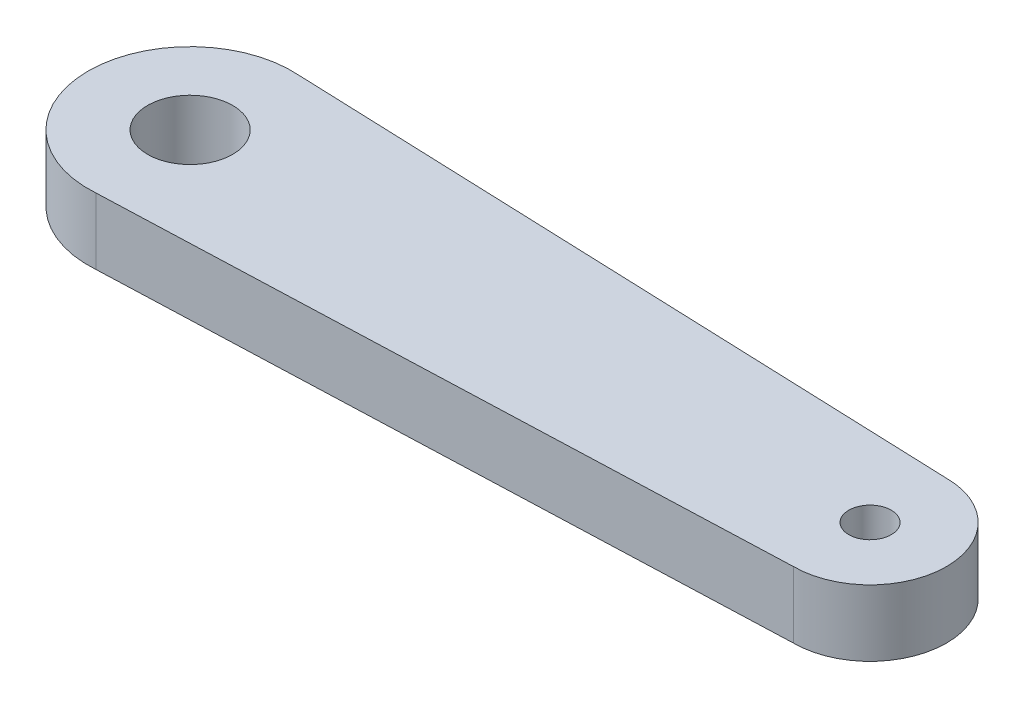
ISO-10303-21;
HEADER;
FILE_DESCRIPTION(('STEP AP214'),'2;1');
FILE_NAME('part.step','',(''),(''),'','','');
FILE_SCHEMA(('AUTOMOTIVE_DESIGN { 1 0 10303 214 1 1 1 1 }'));
ENDSEC;
DATA;
#1=APPLICATION_CONTEXT('core data for automotive mechanical design processes');
#2=APPLICATION_PROTOCOL_DEFINITION('international standard','automotive_design',2000,#1);
#3=PRODUCT_CONTEXT('',#1,'mechanical');
#4=PRODUCT('Part','Part','',(#3));
#5=PRODUCT_RELATED_PRODUCT_CATEGORY('part','',(#4));
#6=PRODUCT_DEFINITION_FORMATION('','',#4);
#7=PRODUCT_DEFINITION_CONTEXT('part definition',#1,'design');
#8=PRODUCT_DEFINITION('design','',#6,#7);
#9=PRODUCT_DEFINITION_SHAPE('','',#8);
#10=(LENGTH_UNIT() NAMED_UNIT(*) SI_UNIT(.MILLI.,.METRE.));
#11=(NAMED_UNIT(*) PLANE_ANGLE_UNIT() SI_UNIT($,.RADIAN.));
#12=(NAMED_UNIT(*) SI_UNIT($,.STERADIAN.) SOLID_ANGLE_UNIT());
#13=UNCERTAINTY_MEASURE_WITH_UNIT(LENGTH_MEASURE(1.E-05),#10,'distance_accuracy_value','');
#14=(GEOMETRIC_REPRESENTATION_CONTEXT(3) GLOBAL_UNCERTAINTY_ASSIGNED_CONTEXT((#13)) GLOBAL_UNIT_ASSIGNED_CONTEXT((#10,
#11,#12)) REPRESENTATION_CONTEXT('',''));
#15=CARTESIAN_POINT('',(0.,0.,0.));
#16=DIRECTION('',(0.,0.,1.));
#17=DIRECTION('',(1.,0.,0.));
#18=AXIS2_PLACEMENT_3D('',#15,#16,#17);
#19=CARTESIAN_POINT('',(0.,3.9,0.));
#20=DIRECTION('',(0.,-1.,0.));
#21=DIRECTION('',(0.,0.,-1.));
#22=AXIS2_PLACEMENT_3D('',#19,#20,#21);
#23=CYLINDRICAL_SURFACE('',#22,6.);
#24=CARTESIAN_POINT('',(0.,0.,0.));
#25=DIRECTION('',(0.,1.,0.));
#26=DIRECTION('',(0.,0.,1.));
#27=AXIS2_PLACEMENT_3D('',#24,#25,#26);
#28=CIRCLE('',#27,6.);
#29=CARTESIAN_POINT('',(0.449368076142934,0.,-5.98314869714464));
#30=VERTEX_POINT('',#29);
#31=CARTESIAN_POINT('',(0.449368076142934,0.,5.98314869714464));
#32=VERTEX_POINT('',#31);
#33=EDGE_CURVE('E110',#30,#32,#28,.T.);
#34=ORIENTED_EDGE('',*,*,#33,.T.);
#35=DIRECTION('',(0.,-1.,0.));
#36=VECTOR('',#35,1.);
#37=CARTESIAN_POINT('',(0.449368076142934,3.9,5.98314869714464));
#38=LINE('',#37,#36);
#39=CARTESIAN_POINT('',(0.449368076142934,3.9,5.98314869714464));
#40=VERTEX_POINT('',#39);
#41=EDGE_CURVE('E11',#40,#32,#38,.T.);
#42=ORIENTED_EDGE('',*,*,#41,.F.);
#43=CARTESIAN_POINT('',(0.,3.9,0.));
#44=DIRECTION('',(0.,1.,0.));
#45=DIRECTION('',(0.,0.,1.));
#46=AXIS2_PLACEMENT_3D('',#43,#44,#45);
#47=CIRCLE('',#46,6.);
#48=CARTESIAN_POINT('',(0.449368076142934,3.9,-5.98314869714464));
#49=VERTEX_POINT('',#48);
#50=EDGE_CURVE('E91',#49,#40,#47,.T.);
#51=ORIENTED_EDGE('',*,*,#50,.F.);
#52=DIRECTION('',(0.,-1.,0.));
#53=VECTOR('',#52,1.);
#54=CARTESIAN_POINT('',(0.449368076142934,3.9,-5.98314869714464));
#55=LINE('',#54,#53);
#56=EDGE_CURVE('E58',#49,#30,#55,.T.);
#57=ORIENTED_EDGE('',*,*,#56,.T.);
#58=EDGE_LOOP('',(#34,#42,#51,#57));
#59=FACE_BOUND('',#58,.T.);
#60=ADVANCED_FACE('F39',(#59),#23,.T.);
#61=CARTESIAN_POINT('',(0.449368076142934,3.9,5.98314869714464));
#62=DIRECTION('',(-0.0374736605890943,0.,-0.999297615709181));
#63=DIRECTION('',(-0.999297615709181,0.,0.0374736605890943));
#64=AXIS2_PLACEMENT_3D('',#61,#62,#63);
#65=PLANE('',#64);
#66=DIRECTION('',(0.999297615709181,0.,-0.0374736605890943));
#67=VECTOR('',#66,1.);
#68=CARTESIAN_POINT('',(0.449368076142934,0.,5.98314869714464));
#69=LINE('',#68,#67);
#70=CARTESIAN_POINT('',(40.,0.,4.5));
#71=VERTEX_POINT('',#70);
#72=EDGE_CURVE('E97',#32,#71,#69,.T.);
#73=ORIENTED_EDGE('',*,*,#72,.T.);
#74=DIRECTION('',(0.,-1.,0.));
#75=VECTOR('',#74,1.);
#76=CARTESIAN_POINT('',(40.,3.9,4.5));
#77=LINE('',#76,#75);
#78=CARTESIAN_POINT('',(40.,3.9,4.5));
#79=VERTEX_POINT('',#78);
#80=EDGE_CURVE('E49',#79,#71,#77,.T.);
#81=ORIENTED_EDGE('',*,*,#80,.F.);
#82=DIRECTION('',(0.999297615709181,0.,-0.0374736605890943));
#83=VECTOR('',#82,1.);
#84=CARTESIAN_POINT('',(0.449368076142934,3.9,5.98314869714464));
#85=LINE('',#84,#83);
#86=EDGE_CURVE('E84',#40,#79,#85,.T.);
#87=ORIENTED_EDGE('',*,*,#86,.F.);
#88=ORIENTED_EDGE('',*,*,#41,.T.);
#89=EDGE_LOOP('',(#73,#81,#87,#88));
#90=FACE_BOUND('',#89,.T.);
#91=ADVANCED_FACE('F96',(#90),#65,.F.);
#92=CARTESIAN_POINT('',(40.,3.9,0.));
#93=DIRECTION('',(0.,-1.,0.));
#94=DIRECTION('',(0.,0.,-1.));
#95=AXIS2_PLACEMENT_3D('',#92,#93,#94);
#96=CYLINDRICAL_SURFACE('',#95,4.5);
#97=CARTESIAN_POINT('',(40.,0.,0.));
#98=DIRECTION('',(0.,1.,0.));
#99=DIRECTION('',(0.,0.,1.));
#100=AXIS2_PLACEMENT_3D('',#97,#98,#99);
#101=CIRCLE('',#100,4.5);
#102=CARTESIAN_POINT('',(40.,0.,-4.5));
#103=VERTEX_POINT('',#102);
#104=EDGE_CURVE('E116',#71,#103,#101,.T.);
#105=ORIENTED_EDGE('',*,*,#104,.T.);
#106=DIRECTION('',(0.,-1.,0.));
#107=VECTOR('',#106,1.);
#108=CARTESIAN_POINT('',(40.,3.9,-4.5));
#109=LINE('',#108,#107);
#110=CARTESIAN_POINT('',(40.,3.9,-4.5));
#111=VERTEX_POINT('',#110);
#112=EDGE_CURVE('E73',#111,#103,#109,.T.);
#113=ORIENTED_EDGE('',*,*,#112,.F.);
#114=CARTESIAN_POINT('',(40.,3.9,0.));
#115=DIRECTION('',(0.,1.,0.));
#116=DIRECTION('',(0.,0.,1.));
#117=AXIS2_PLACEMENT_3D('',#114,#115,#116);
#118=CIRCLE('',#117,4.5);
#119=EDGE_CURVE('E90',#79,#111,#118,.T.);
#120=ORIENTED_EDGE('',*,*,#119,.F.);
#121=ORIENTED_EDGE('',*,*,#80,.T.);
#122=EDGE_LOOP('',(#105,#113,#120,#121));
#123=FACE_BOUND('',#122,.T.);
#124=ADVANCED_FACE('F102',(#123),#96,.T.);
#125=CARTESIAN_POINT('',(0.449368076142934,3.9,-5.98314869714464));
#126=DIRECTION('',(0.0374736605890943,0.,-0.999297615709181));
#127=DIRECTION('',(-0.999297615709181,0.,-0.0374736605890943));
#128=AXIS2_PLACEMENT_3D('',#125,#126,#127);
#129=PLANE('',#128);
#130=DIRECTION('',(0.999297615709181,0.,0.0374736605890943));
#131=VECTOR('',#130,1.);
#132=CARTESIAN_POINT('',(0.449368076142934,0.,-5.98314869714464));
#133=LINE('',#132,#131);
#134=EDGE_CURVE('E119',#30,#103,#133,.T.);
#135=ORIENTED_EDGE('',*,*,#134,.F.);
#136=ORIENTED_EDGE('',*,*,#56,.F.);
#137=DIRECTION('',(0.999297615709181,0.,0.0374736605890943));
#138=VECTOR('',#137,1.);
#139=CARTESIAN_POINT('',(0.449368076142934,3.9,-5.98314869714464));
#140=LINE('',#139,#138);
#141=EDGE_CURVE('E104',#49,#111,#140,.T.);
#142=ORIENTED_EDGE('',*,*,#141,.T.);
#143=ORIENTED_EDGE('',*,*,#112,.T.);
#144=EDGE_LOOP('',(#135,#136,#142,#143));
#145=FACE_BOUND('',#144,.T.);
#146=ADVANCED_FACE('F158',(#145),#129,.T.);
#147=CARTESIAN_POINT('',(0.,3.9,0.));
#148=DIRECTION('',(0.,1.,0.));
#149=DIRECTION('',(0.,0.,1.));
#150=AXIS2_PLACEMENT_3D('',#147,#148,#149);
#151=PLANE('',#150);
#152=CARTESIAN_POINT('',(0.,3.9,0.));
#153=DIRECTION('',(0.,1.,0.));
#154=DIRECTION('',(0.,0.,1.));
#155=AXIS2_PLACEMENT_3D('',#152,#153,#154);
#156=CIRCLE('',#155,2.5);
#157=CARTESIAN_POINT('',(0.,3.9,2.5));
#158=VERTEX_POINT('',#157);
#159=EDGE_CURVE('E113',#158,#158,#156,.F.);
#160=ORIENTED_EDGE('',*,*,#159,.T.);
#161=EDGE_LOOP('',(#160));
#162=FACE_BOUND('',#161,.T.);
#163=CARTESIAN_POINT('',(40.,3.9,0.));
#164=DIRECTION('',(0.,1.,0.));
#165=DIRECTION('',(0.,0.,1.));
#166=AXIS2_PLACEMENT_3D('',#163,#164,#165);
#167=CIRCLE('',#166,1.25);
#168=CARTESIAN_POINT('',(40.,3.9,1.25));
#169=VERTEX_POINT('',#168);
#170=EDGE_CURVE('E129',#169,#169,#167,.F.);
#171=ORIENTED_EDGE('',*,*,#170,.T.);
#172=EDGE_LOOP('',(#171));
#173=FACE_BOUND('',#172,.T.);
#174=ORIENTED_EDGE('',*,*,#50,.T.);
#175=ORIENTED_EDGE('',*,*,#86,.T.);
#176=ORIENTED_EDGE('',*,*,#119,.T.);
#177=ORIENTED_EDGE('',*,*,#141,.F.);
#178=EDGE_LOOP('',(#174,#175,#176,#177));
#179=FACE_BOUND('',#178,.T.);
#180=ADVANCED_FACE('F87',(#162,#173,#179),#151,.T.);
#181=CARTESIAN_POINT('',(0.,0.,0.));
#182=DIRECTION('',(0.,1.,0.));
#183=DIRECTION('',(0.,0.,1.));
#184=AXIS2_PLACEMENT_3D('',#181,#182,#183);
#185=PLANE('',#184);
#186=CARTESIAN_POINT('',(0.,0.,0.));
#187=DIRECTION('',(0.,1.,0.));
#188=DIRECTION('',(0.,0.,1.));
#189=AXIS2_PLACEMENT_3D('',#186,#187,#188);
#190=CIRCLE('',#189,2.5);
#191=CARTESIAN_POINT('',(0.,0.,2.5));
#192=VERTEX_POINT('',#191);
#193=EDGE_CURVE('E42',#192,#192,#190,.F.);
#194=ORIENTED_EDGE('',*,*,#193,.F.);
#195=EDGE_LOOP('',(#194));
#196=FACE_BOUND('',#195,.T.);
#197=CARTESIAN_POINT('',(40.,0.,0.));
#198=DIRECTION('',(0.,1.,0.));
#199=DIRECTION('',(0.,0.,1.));
#200=AXIS2_PLACEMENT_3D('',#197,#198,#199);
#201=CIRCLE('',#200,1.25);
#202=CARTESIAN_POINT('',(40.,0.,1.25));
#203=VERTEX_POINT('',#202);
#204=EDGE_CURVE('E126',#203,#203,#201,.F.);
#205=ORIENTED_EDGE('',*,*,#204,.F.);
#206=EDGE_LOOP('',(#205));
#207=FACE_BOUND('',#206,.T.);
#208=ORIENTED_EDGE('',*,*,#33,.F.);
#209=ORIENTED_EDGE('',*,*,#134,.T.);
#210=ORIENTED_EDGE('',*,*,#104,.F.);
#211=ORIENTED_EDGE('',*,*,#72,.F.);
#212=EDGE_LOOP('',(#208,#209,#210,#211));
#213=FACE_BOUND('',#212,.T.);
#214=ADVANCED_FACE('F153',(#196,#207,#213),#185,.F.);
#215=CARTESIAN_POINT('',(40.,19.9,0.));
#216=DIRECTION('',(0.,-1.,0.));
#217=DIRECTION('',(0.,0.,-1.));
#218=AXIS2_PLACEMENT_3D('',#215,#216,#217);
#219=CYLINDRICAL_SURFACE('',#218,1.25);
#220=ORIENTED_EDGE('',*,*,#170,.F.);
#221=EDGE_LOOP('',(#220));
#222=FACE_BOUND('',#221,.T.);
#223=ORIENTED_EDGE('',*,*,#204,.T.);
#224=EDGE_LOOP('',(#223));
#225=FACE_BOUND('',#224,.T.);
#226=ADVANCED_FACE('F149',(#222,#225),#219,.F.);
#227=CARTESIAN_POINT('',(0.,19.9,0.));
#228=DIRECTION('',(0.,-1.,0.));
#229=DIRECTION('',(0.,0.,-1.));
#230=AXIS2_PLACEMENT_3D('',#227,#228,#229);
#231=CYLINDRICAL_SURFACE('',#230,2.5);
#232=ORIENTED_EDGE('',*,*,#159,.F.);
#233=EDGE_LOOP('',(#232));
#234=FACE_BOUND('',#233,.T.);
#235=ORIENTED_EDGE('',*,*,#193,.T.);
#236=EDGE_LOOP('',(#235));
#237=FACE_BOUND('',#236,.T.);
#238=ADVANCED_FACE('F146',(#234,#237),#231,.F.);
#239=CLOSED_SHELL('',(#60,#91,#124,#146,#180,#214,#226,#238));
#240=MANIFOLD_SOLID_BREP('B2',#239);
#241=ADVANCED_BREP_SHAPE_REPRESENTATION('',(#18,#240),#14);
#242=SHAPE_DEFINITION_REPRESENTATION(#9,#241);
ENDSEC;
END-ISO-10303-21;
